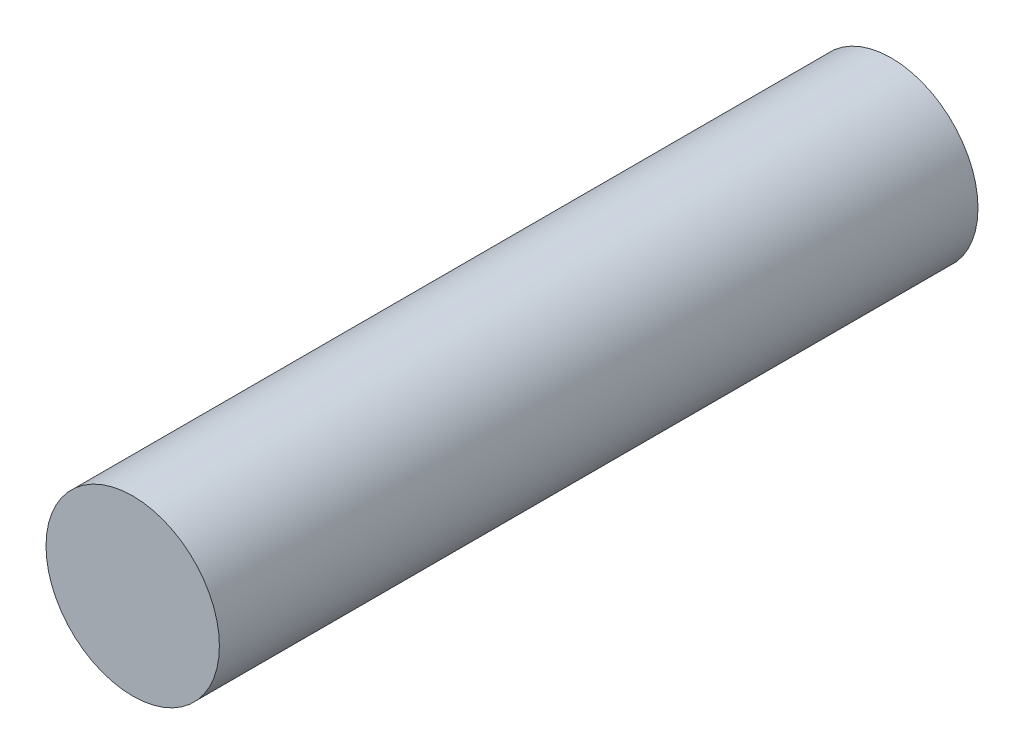
ISO-10303-21;
HEADER;
FILE_DESCRIPTION(('STEP AP214'),'2;1');
FILE_NAME('part.step','',(''),(''),'','','');
FILE_SCHEMA(('AUTOMOTIVE_DESIGN { 1 0 10303 214 1 1 1 1 }'));
ENDSEC;
DATA;
#1=APPLICATION_CONTEXT('core data for automotive mechanical design processes');
#2=APPLICATION_PROTOCOL_DEFINITION('international standard','automotive_design',2000,#1);
#3=PRODUCT_CONTEXT('',#1,'mechanical');
#4=PRODUCT('Part','Part','',(#3));
#5=PRODUCT_RELATED_PRODUCT_CATEGORY('part','',(#4));
#6=PRODUCT_DEFINITION_FORMATION('','',#4);
#7=PRODUCT_DEFINITION_CONTEXT('part definition',#1,'design');
#8=PRODUCT_DEFINITION('design','',#6,#7);
#9=PRODUCT_DEFINITION_SHAPE('','',#8);
#10=(LENGTH_UNIT() NAMED_UNIT(*) SI_UNIT(.MILLI.,.METRE.));
#11=(NAMED_UNIT(*) PLANE_ANGLE_UNIT() SI_UNIT($,.RADIAN.));
#12=(NAMED_UNIT(*) SI_UNIT($,.STERADIAN.) SOLID_ANGLE_UNIT());
#13=UNCERTAINTY_MEASURE_WITH_UNIT(LENGTH_MEASURE(1.E-05),#10,'distance_accuracy_value','');
#14=(GEOMETRIC_REPRESENTATION_CONTEXT(3) GLOBAL_UNCERTAINTY_ASSIGNED_CONTEXT((#13)) GLOBAL_UNIT_ASSIGNED_CONTEXT((#10,
#11,#12)) REPRESENTATION_CONTEXT('',''));
#15=CARTESIAN_POINT('',(0.,0.,0.));
#16=DIRECTION('',(0.,0.,1.));
#17=DIRECTION('',(1.,0.,0.));
#18=AXIS2_PLACEMENT_3D('',#15,#16,#17);
#19=CARTESIAN_POINT('',(0.,0.,-35.));
#20=DIRECTION('',(0.,0.,-1.));
#21=DIRECTION('',(-1.,0.,0.));
#22=AXIS2_PLACEMENT_3D('',#19,#20,#21);
#23=PLANE('',#22);
#24=CARTESIAN_POINT('',(0.,0.,-35.));
#25=DIRECTION('',(0.,0.,1.));
#26=DIRECTION('',(1.,0.,0.));
#27=AXIS2_PLACEMENT_3D('',#24,#25,#26);
#28=CIRCLE('',#27,4.);
#29=CARTESIAN_POINT('',(4.,0.,-35.));
#30=VERTEX_POINT('',#29);
#31=EDGE_CURVE('E10',#30,#30,#28,.T.);
#32=ORIENTED_EDGE('',*,*,#31,.F.);
#33=EDGE_LOOP('',(#32));
#34=FACE_BOUND('',#33,.T.);
#35=ADVANCED_FACE('F32',(#34),#23,.T.);
#36=CARTESIAN_POINT('',(0.,0.,0.));
#37=DIRECTION('',(0.,0.,1.));
#38=DIRECTION('',(1.,0.,0.));
#39=AXIS2_PLACEMENT_3D('',#36,#37,#38);
#40=CYLINDRICAL_SURFACE('',#39,4.);
#41=ORIENTED_EDGE('',*,*,#31,.T.);
#42=EDGE_LOOP('',(#41));
#43=FACE_BOUND('',#42,.T.);
#44=CARTESIAN_POINT('',(0.,0.,0.));
#45=DIRECTION('',(0.,0.,1.));
#46=DIRECTION('',(1.,0.,0.));
#47=AXIS2_PLACEMENT_3D('',#44,#45,#46);
#48=CIRCLE('',#47,4.);
#49=CARTESIAN_POINT('',(4.,0.,0.));
#50=VERTEX_POINT('',#49);
#51=EDGE_CURVE('E38',#50,#50,#48,.T.);
#52=ORIENTED_EDGE('',*,*,#51,.F.);
#53=EDGE_LOOP('',(#52));
#54=FACE_BOUND('',#53,.T.);
#55=ADVANCED_FACE('F46',(#43,#54),#40,.T.);
#56=CARTESIAN_POINT('',(0.,0.,0.));
#57=DIRECTION('',(0.,0.,1.));
#58=DIRECTION('',(1.,0.,0.));
#59=AXIS2_PLACEMENT_3D('',#56,#57,#58);
#60=PLANE('',#59);
#61=ORIENTED_EDGE('',*,*,#51,.T.);
#62=EDGE_LOOP('',(#61));
#63=FACE_BOUND('',#62,.T.);
#64=ADVANCED_FACE('F44',(#63),#60,.T.);
#65=CLOSED_SHELL('',(#35,#55,#64));
#66=MANIFOLD_SOLID_BREP('B2',#65);
#67=ADVANCED_BREP_SHAPE_REPRESENTATION('',(#18,#66),#14);
#68=SHAPE_DEFINITION_REPRESENTATION(#9,#67);
ENDSEC;
END-ISO-10303-21;
